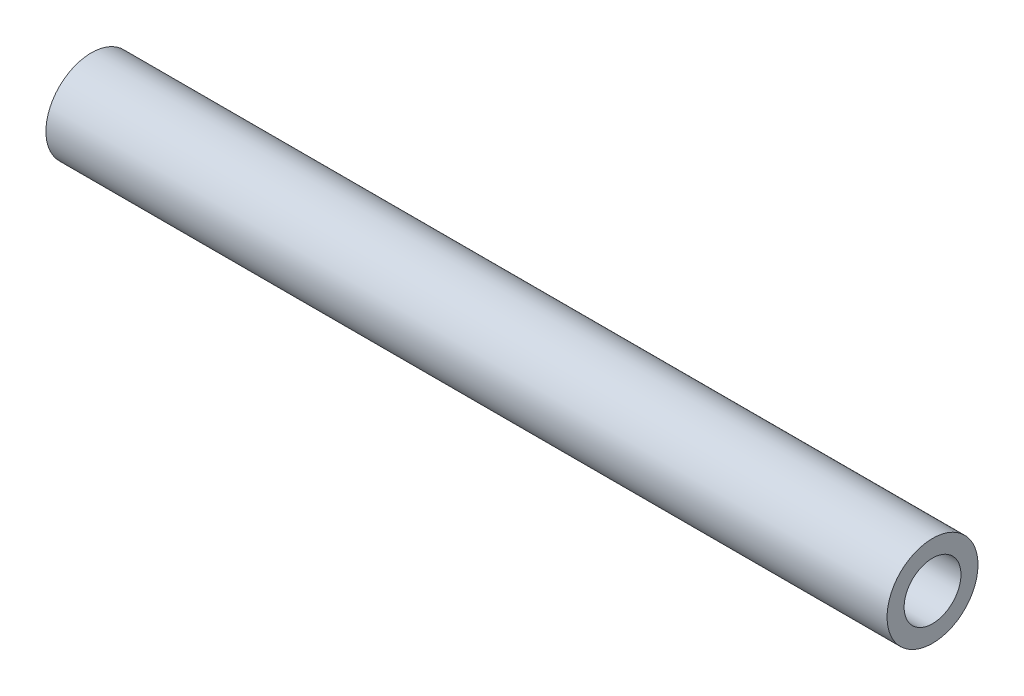
ISO-10303-21;
HEADER;
FILE_DESCRIPTION(('STEP AP214'),'2;1');
FILE_NAME('part.step','',(''),(''),'','','');
FILE_SCHEMA(('AUTOMOTIVE_DESIGN { 1 0 10303 214 1 1 1 1 }'));
ENDSEC;
DATA;
#1=APPLICATION_CONTEXT('core data for automotive mechanical design processes');
#2=APPLICATION_PROTOCOL_DEFINITION('international standard','automotive_design',2000,#1);
#3=PRODUCT_CONTEXT('',#1,'mechanical');
#4=PRODUCT('Part','Part','',(#3));
#5=PRODUCT_RELATED_PRODUCT_CATEGORY('part','',(#4));
#6=PRODUCT_DEFINITION_FORMATION('','',#4);
#7=PRODUCT_DEFINITION_CONTEXT('part definition',#1,'design');
#8=PRODUCT_DEFINITION('design','',#6,#7);
#9=PRODUCT_DEFINITION_SHAPE('','',#8);
#10=(LENGTH_UNIT() NAMED_UNIT(*) SI_UNIT(.MILLI.,.METRE.));
#11=(NAMED_UNIT(*) PLANE_ANGLE_UNIT() SI_UNIT($,.RADIAN.));
#12=(NAMED_UNIT(*) SI_UNIT($,.STERADIAN.) SOLID_ANGLE_UNIT());
#13=UNCERTAINTY_MEASURE_WITH_UNIT(LENGTH_MEASURE(1.E-05),#10,'distance_accuracy_value','');
#14=(GEOMETRIC_REPRESENTATION_CONTEXT(3) GLOBAL_UNCERTAINTY_ASSIGNED_CONTEXT((#13)) GLOBAL_UNIT_ASSIGNED_CONTEXT((#10,
#11,#12)) REPRESENTATION_CONTEXT('',''));
#15=CARTESIAN_POINT('',(0.,0.,0.));
#16=DIRECTION('',(0.,0.,1.));
#17=DIRECTION('',(1.,0.,0.));
#18=AXIS2_PLACEMENT_3D('',#15,#16,#17);
#19=CARTESIAN_POINT('',(37.,0.,0.));
#20=DIRECTION('',(-1.,0.,0.));
#21=DIRECTION('',(0.,0.,1.));
#22=AXIS2_PLACEMENT_3D('',#19,#20,#21);
#23=CYLINDRICAL_SURFACE('',#22,4.);
#24=CARTESIAN_POINT('',(37.,0.,0.));
#25=DIRECTION('',(1.,0.,0.));
#26=DIRECTION('',(0.,0.,-1.));
#27=AXIS2_PLACEMENT_3D('',#24,#25,#26);
#28=CIRCLE('',#27,4.);
#29=CARTESIAN_POINT('',(37.,0.,-4.));
#30=VERTEX_POINT('',#29);
#31=EDGE_CURVE('E10',#30,#30,#28,.T.);
#32=ORIENTED_EDGE('',*,*,#31,.F.);
#33=EDGE_LOOP('',(#32));
#34=FACE_BOUND('',#33,.T.);
#35=CARTESIAN_POINT('',(-37.,0.,0.));
#36=DIRECTION('',(1.,0.,0.));
#37=DIRECTION('',(0.,0.,-1.));
#38=AXIS2_PLACEMENT_3D('',#35,#36,#37);
#39=CIRCLE('',#38,4.);
#40=CARTESIAN_POINT('',(-37.,0.,-4.));
#41=VERTEX_POINT('',#40);
#42=EDGE_CURVE('E38',#41,#41,#39,.T.);
#43=ORIENTED_EDGE('',*,*,#42,.T.);
#44=EDGE_LOOP('',(#43));
#45=FACE_BOUND('',#44,.T.);
#46=ADVANCED_FACE('F35',(#34,#45),#23,.T.);
#47=CARTESIAN_POINT('',(37.,0.,0.));
#48=DIRECTION('',(1.,0.,0.));
#49=DIRECTION('',(0.,0.,-1.));
#50=AXIS2_PLACEMENT_3D('',#47,#48,#49);
#51=PLANE('',#50);
#52=CARTESIAN_POINT('',(37.,0.,0.));
#53=DIRECTION('',(1.,0.,0.));
#54=DIRECTION('',(0.,0.,-1.));
#55=AXIS2_PLACEMENT_3D('',#52,#53,#54);
#56=CIRCLE('',#55,2.5);
#57=CARTESIAN_POINT('',(37.,0.,-2.5));
#58=VERTEX_POINT('',#57);
#59=EDGE_CURVE('E47',#58,#58,#56,.T.);
#60=ORIENTED_EDGE('',*,*,#59,.F.);
#61=EDGE_LOOP('',(#60));
#62=FACE_BOUND('',#61,.T.);
#63=ORIENTED_EDGE('',*,*,#31,.T.);
#64=EDGE_LOOP('',(#63));
#65=FACE_BOUND('',#64,.T.);
#66=ADVANCED_FACE('F71',(#62,#65),#51,.T.);
#67=CARTESIAN_POINT('',(-37.,0.,0.));
#68=DIRECTION('',(1.,0.,0.));
#69=DIRECTION('',(0.,0.,-1.));
#70=AXIS2_PLACEMENT_3D('',#67,#68,#69);
#71=PLANE('',#70);
#72=CARTESIAN_POINT('',(-37.,0.,0.));
#73=DIRECTION('',(1.,0.,0.));
#74=DIRECTION('',(0.,0.,-1.));
#75=AXIS2_PLACEMENT_3D('',#72,#73,#74);
#76=CIRCLE('',#75,2.5);
#77=CARTESIAN_POINT('',(-37.,0.,-2.5));
#78=VERTEX_POINT('',#77);
#79=EDGE_CURVE('E53',#78,#78,#76,.T.);
#80=ORIENTED_EDGE('',*,*,#79,.T.);
#81=EDGE_LOOP('',(#80));
#82=FACE_BOUND('',#81,.T.);
#83=ORIENTED_EDGE('',*,*,#42,.F.);
#84=EDGE_LOOP('',(#83));
#85=FACE_BOUND('',#84,.T.);
#86=ADVANCED_FACE('F76',(#82,#85),#71,.F.);
#87=CARTESIAN_POINT('',(22.,0.,0.));
#88=DIRECTION('',(1.,0.,0.));
#89=DIRECTION('',(0.,0.,-1.));
#90=AXIS2_PLACEMENT_3D('',#87,#88,#89);
#91=CYLINDRICAL_SURFACE('',#90,2.5);
#92=CARTESIAN_POINT('',(22.,0.,0.));
#93=DIRECTION('',(1.,0.,0.));
#94=DIRECTION('',(0.,0.,-1.));
#95=AXIS2_PLACEMENT_3D('',#92,#93,#94);
#96=CIRCLE('',#95,2.5);
#97=CARTESIAN_POINT('',(22.,0.,-2.5));
#98=VERTEX_POINT('',#97);
#99=EDGE_CURVE('E45',#98,#98,#96,.T.);
#100=ORIENTED_EDGE('',*,*,#99,.F.);
#101=EDGE_LOOP('',(#100));
#102=FACE_BOUND('',#101,.T.);
#103=ORIENTED_EDGE('',*,*,#59,.T.);
#104=EDGE_LOOP('',(#103));
#105=FACE_BOUND('',#104,.T.);
#106=ADVANCED_FACE('F83',(#102,#105),#91,.F.);
#107=CARTESIAN_POINT('',(22.,0.,0.));
#108=DIRECTION('',(1.,0.,0.));
#109=DIRECTION('',(0.,0.,-1.));
#110=AXIS2_PLACEMENT_3D('',#107,#108,#109);
#111=PLANE('',#110);
#112=ORIENTED_EDGE('',*,*,#99,.T.);
#113=EDGE_LOOP('',(#112));
#114=FACE_BOUND('',#113,.T.);
#115=ADVANCED_FACE('F68',(#114),#111,.T.);
#116=CARTESIAN_POINT('',(-22.,0.,0.));
#117=DIRECTION('',(-1.,0.,0.));
#118=DIRECTION('',(0.,0.,1.));
#119=AXIS2_PLACEMENT_3D('',#116,#117,#118);
#120=CYLINDRICAL_SURFACE('',#119,2.5);
#121=CARTESIAN_POINT('',(-22.,0.,0.));
#122=DIRECTION('',(1.,0.,0.));
#123=DIRECTION('',(0.,0.,-1.));
#124=AXIS2_PLACEMENT_3D('',#121,#122,#123);
#125=CIRCLE('',#124,2.5);
#126=CARTESIAN_POINT('',(-22.,0.,-2.5));
#127=VERTEX_POINT('',#126);
#128=EDGE_CURVE('E50',#127,#127,#125,.T.);
#129=ORIENTED_EDGE('',*,*,#128,.T.);
#130=EDGE_LOOP('',(#129));
#131=FACE_BOUND('',#130,.T.);
#132=ORIENTED_EDGE('',*,*,#79,.F.);
#133=EDGE_LOOP('',(#132));
#134=FACE_BOUND('',#133,.T.);
#135=ADVANCED_FACE('F59',(#131,#134),#120,.F.);
#136=CARTESIAN_POINT('',(-22.,0.,0.));
#137=DIRECTION('',(-1.,0.,0.));
#138=DIRECTION('',(0.,0.,-1.));
#139=AXIS2_PLACEMENT_3D('',#136,#137,#138);
#140=PLANE('',#139);
#141=ORIENTED_EDGE('',*,*,#128,.F.);
#142=EDGE_LOOP('',(#141));
#143=FACE_BOUND('',#142,.T.);
#144=ADVANCED_FACE('F62',(#143),#140,.T.);
#145=CLOSED_SHELL('',(#46,#66,#86,#106,#115,#135,#144));
#146=MANIFOLD_SOLID_BREP('B2',#145);
#147=ADVANCED_BREP_SHAPE_REPRESENTATION('',(#18,#146),#14);
#148=SHAPE_DEFINITION_REPRESENTATION(#9,#147);
ENDSEC;
END-ISO-10303-21;
